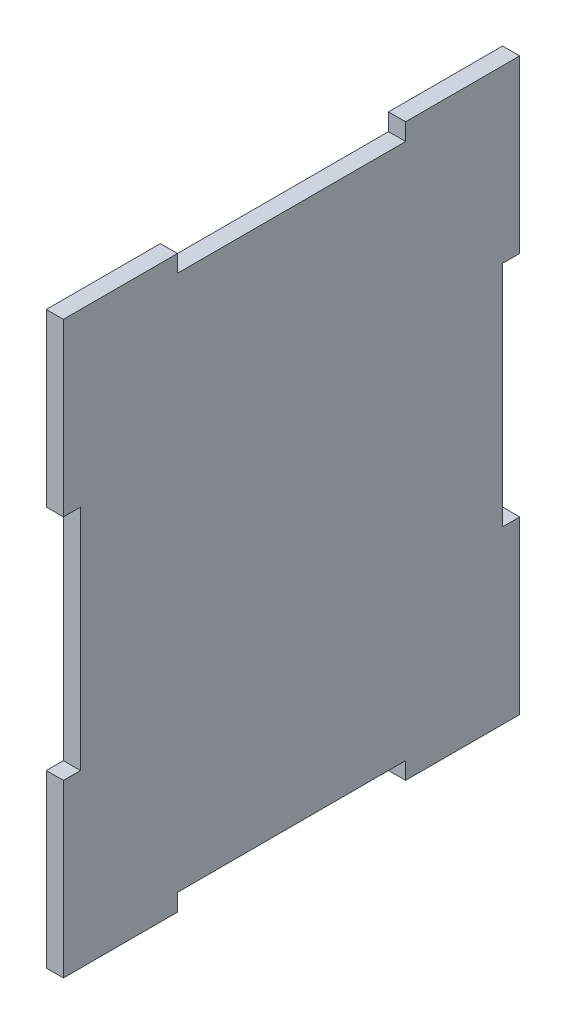
ISO-10303-21;
HEADER;
FILE_DESCRIPTION(('STEP AP214'),'2;1');
FILE_NAME('part.step','',(''),(''),'','','');
FILE_SCHEMA(('AUTOMOTIVE_DESIGN { 1 0 10303 214 1 1 1 1 }'));
ENDSEC;
DATA;
#1=APPLICATION_CONTEXT('core data for automotive mechanical design processes');
#2=APPLICATION_PROTOCOL_DEFINITION('international standard','automotive_design',2000,#1);
#3=PRODUCT_CONTEXT('',#1,'mechanical');
#4=PRODUCT('Part','Part','',(#3));
#5=PRODUCT_RELATED_PRODUCT_CATEGORY('part','',(#4));
#6=PRODUCT_DEFINITION_FORMATION('','',#4);
#7=PRODUCT_DEFINITION_CONTEXT('part definition',#1,'design');
#8=PRODUCT_DEFINITION('design','',#6,#7);
#9=PRODUCT_DEFINITION_SHAPE('','',#8);
#10=(LENGTH_UNIT() NAMED_UNIT(*) SI_UNIT(.MILLI.,.METRE.));
#11=(NAMED_UNIT(*) PLANE_ANGLE_UNIT() SI_UNIT($,.RADIAN.));
#12=(NAMED_UNIT(*) SI_UNIT($,.STERADIAN.) SOLID_ANGLE_UNIT());
#13=UNCERTAINTY_MEASURE_WITH_UNIT(LENGTH_MEASURE(1.E-05),#10,'distance_accuracy_value','');
#14=(GEOMETRIC_REPRESENTATION_CONTEXT(3) GLOBAL_UNCERTAINTY_ASSIGNED_CONTEXT((#13)) GLOBAL_UNIT_ASSIGNED_CONTEXT((#10,
#11,#12)) REPRESENTATION_CONTEXT('',''));
#15=CARTESIAN_POINT('',(0.,0.,0.));
#16=DIRECTION('',(0.,0.,1.));
#17=DIRECTION('',(1.,0.,0.));
#18=AXIS2_PLACEMENT_3D('',#15,#16,#17);
#19=CARTESIAN_POINT('',(3.,38.0748800600968,25.7354760894386));
#20=DIRECTION('',(0.,0.,-1.));
#21=DIRECTION('',(0.,1.,0.));
#22=AXIS2_PLACEMENT_3D('',#19,#20,#21);
#23=PLANE('',#22);
#24=DIRECTION('',(0.,-1.,0.));
#25=VECTOR('',#24,1.);
#26=CARTESIAN_POINT('',(0.,38.0748800600968,25.7354760894386));
#27=LINE('',#26,#25);
#28=CARTESIAN_POINT('',(0.,38.0748800600968,25.7354760894386));
#29=VERTEX_POINT('',#28);
#30=CARTESIAN_POINT('',(0.,8.07488006009679,25.7354760894386));
#31=VERTEX_POINT('',#30);
#32=EDGE_CURVE('E201',#29,#31,#27,.T.);
#33=ORIENTED_EDGE('',*,*,#32,.T.);
#34=DIRECTION('',(-1.,0.,0.));
#35=VECTOR('',#34,1.);
#36=CARTESIAN_POINT('',(3.,8.07488006009679,25.7354760894386));
#37=LINE('',#36,#35);
#38=CARTESIAN_POINT('',(3.,8.07488006009679,25.7354760894386));
#39=VERTEX_POINT('',#38);
#40=EDGE_CURVE('E11',#39,#31,#37,.T.);
#41=ORIENTED_EDGE('',*,*,#40,.F.);
#42=DIRECTION('',(0.,-1.,0.));
#43=VECTOR('',#42,1.);
#44=CARTESIAN_POINT('',(3.,38.0748800600968,25.7354760894386));
#45=LINE('',#44,#43);
#46=CARTESIAN_POINT('',(3.,38.0748800600968,25.7354760894386));
#47=VERTEX_POINT('',#46);
#48=EDGE_CURVE('E239',#47,#39,#45,.T.);
#49=ORIENTED_EDGE('',*,*,#48,.F.);
#50=DIRECTION('',(-1.,0.,0.));
#51=VECTOR('',#50,1.);
#52=CARTESIAN_POINT('',(3.,38.0748800600968,25.7354760894386));
#53=LINE('',#52,#51);
#54=EDGE_CURVE('E197',#47,#29,#53,.T.);
#55=ORIENTED_EDGE('',*,*,#54,.T.);
#56=EDGE_LOOP('',(#33,#41,#49,#55));
#57=FACE_BOUND('',#56,.T.);
#58=ADVANCED_FACE('F33',(#57),#23,.F.);
#59=CARTESIAN_POINT('',(3.,8.07488006009678,22.7354760894386));
#60=DIRECTION('',(0.,1.,0.));
#61=DIRECTION('',(0.,0.,1.));
#62=AXIS2_PLACEMENT_3D('',#59,#60,#61);
#63=PLANE('',#62);
#64=DIRECTION('',(0.,0.,-1.));
#65=VECTOR('',#64,1.);
#66=CARTESIAN_POINT('',(0.,8.07488006009678,22.7354760894386));
#67=LINE('',#66,#65);
#68=CARTESIAN_POINT('',(0.,8.07488006009678,22.7354760894386));
#69=VERTEX_POINT('',#68);
#70=EDGE_CURVE('E204',#31,#69,#67,.T.);
#71=ORIENTED_EDGE('',*,*,#70,.T.);
#72=DIRECTION('',(-1.,0.,0.));
#73=VECTOR('',#72,1.);
#74=CARTESIAN_POINT('',(3.,8.07488006009678,22.7354760894386));
#75=LINE('',#74,#73);
#76=CARTESIAN_POINT('',(3.,8.07488006009678,22.7354760894386));
#77=VERTEX_POINT('',#76);
#78=EDGE_CURVE('E41',#77,#69,#75,.T.);
#79=ORIENTED_EDGE('',*,*,#78,.F.);
#80=DIRECTION('',(0.,0.,-1.));
#81=VECTOR('',#80,1.);
#82=CARTESIAN_POINT('',(3.,8.07488006009678,22.7354760894386));
#83=LINE('',#82,#81);
#84=EDGE_CURVE('E128',#39,#77,#83,.T.);
#85=ORIENTED_EDGE('',*,*,#84,.F.);
#86=ORIENTED_EDGE('',*,*,#40,.T.);
#87=EDGE_LOOP('',(#71,#79,#85,#86));
#88=FACE_BOUND('',#87,.T.);
#89=ADVANCED_FACE('F357',(#88),#63,.F.);
#90=CARTESIAN_POINT('',(3.,8.07488006009678,22.7354760894386));
#91=DIRECTION('',(0.,0.,-1.));
#92=DIRECTION('',(0.,1.,0.));
#93=AXIS2_PLACEMENT_3D('',#90,#91,#92);
#94=PLANE('',#93);
#95=DIRECTION('',(0.,-1.,0.));
#96=VECTOR('',#95,1.);
#97=CARTESIAN_POINT('',(0.,8.07488006009678,22.7354760894386));
#98=LINE('',#97,#96);
#99=CARTESIAN_POINT('',(0.,-31.9251199399032,22.7354760894386));
#100=VERTEX_POINT('',#99);
#101=EDGE_CURVE('E206',#69,#100,#98,.T.);
#102=ORIENTED_EDGE('',*,*,#101,.T.);
#103=DIRECTION('',(-1.,0.,0.));
#104=VECTOR('',#103,1.);
#105=CARTESIAN_POINT('',(3.,-31.9251199399032,22.7354760894386));
#106=LINE('',#105,#104);
#107=CARTESIAN_POINT('',(3.,-31.9251199399032,22.7354760894386));
#108=VERTEX_POINT('',#107);
#109=EDGE_CURVE('E282',#108,#100,#106,.T.);
#110=ORIENTED_EDGE('',*,*,#109,.F.);
#111=DIRECTION('',(0.,-1.,0.));
#112=VECTOR('',#111,1.);
#113=CARTESIAN_POINT('',(3.,8.07488006009678,22.7354760894386));
#114=LINE('',#113,#112);
#115=EDGE_CURVE('E290',#77,#108,#114,.T.);
#116=ORIENTED_EDGE('',*,*,#115,.F.);
#117=ORIENTED_EDGE('',*,*,#78,.T.);
#118=EDGE_LOOP('',(#102,#110,#116,#117));
#119=FACE_BOUND('',#118,.T.);
#120=ADVANCED_FACE('F288',(#119),#94,.F.);
#121=CARTESIAN_POINT('',(3.,-31.9251199399032,25.7354760894386));
#122=DIRECTION('',(0.,-1.,0.));
#123=DIRECTION('',(0.,0.,-1.));
#124=AXIS2_PLACEMENT_3D('',#121,#122,#123);
#125=PLANE('',#124);
#126=DIRECTION('',(0.,0.,1.));
#127=VECTOR('',#126,1.);
#128=CARTESIAN_POINT('',(0.,-31.9251199399032,25.7354760894386));
#129=LINE('',#128,#127);
#130=CARTESIAN_POINT('',(0.,-31.9251199399032,25.7354760894386));
#131=VERTEX_POINT('',#130);
#132=EDGE_CURVE('E208',#100,#131,#129,.T.);
#133=ORIENTED_EDGE('',*,*,#132,.T.);
#134=DIRECTION('',(-1.,0.,0.));
#135=VECTOR('',#134,1.);
#136=CARTESIAN_POINT('',(3.,-31.9251199399032,25.7354760894386));
#137=LINE('',#136,#135);
#138=CARTESIAN_POINT('',(3.,-31.9251199399032,25.7354760894386));
#139=VERTEX_POINT('',#138);
#140=EDGE_CURVE('E279',#139,#131,#137,.T.);
#141=ORIENTED_EDGE('',*,*,#140,.F.);
#142=DIRECTION('',(0.,0.,1.));
#143=VECTOR('',#142,1.);
#144=CARTESIAN_POINT('',(3.,-31.9251199399032,25.7354760894386));
#145=LINE('',#144,#143);
#146=EDGE_CURVE('E308',#108,#139,#145,.T.);
#147=ORIENTED_EDGE('',*,*,#146,.F.);
#148=ORIENTED_EDGE('',*,*,#109,.T.);
#149=EDGE_LOOP('',(#133,#141,#147,#148));
#150=FACE_BOUND('',#149,.T.);
#151=ADVANCED_FACE('F299',(#150),#125,.F.);
#152=CARTESIAN_POINT('',(3.,-31.9251199399032,25.7354760894386));
#153=DIRECTION('',(0.,0.,-1.));
#154=DIRECTION('',(0.,1.,0.));
#155=AXIS2_PLACEMENT_3D('',#152,#153,#154);
#156=PLANE('',#155);
#157=DIRECTION('',(0.,-1.,0.));
#158=VECTOR('',#157,1.);
#159=CARTESIAN_POINT('',(0.,-31.9251199399032,25.7354760894386));
#160=LINE('',#159,#158);
#161=CARTESIAN_POINT('',(0.,-61.9251199399032,25.7354760894386));
#162=VERTEX_POINT('',#161);
#163=EDGE_CURVE('E210',#131,#162,#160,.T.);
#164=ORIENTED_EDGE('',*,*,#163,.T.);
#165=DIRECTION('',(-1.,0.,0.));
#166=VECTOR('',#165,1.);
#167=CARTESIAN_POINT('',(3.,-61.9251199399032,25.7354760894386));
#168=LINE('',#167,#166);
#169=CARTESIAN_POINT('',(3.,-61.9251199399032,25.7354760894386));
#170=VERTEX_POINT('',#169);
#171=EDGE_CURVE('E276',#170,#162,#168,.T.);
#172=ORIENTED_EDGE('',*,*,#171,.F.);
#173=DIRECTION('',(0.,-1.,0.));
#174=VECTOR('',#173,1.);
#175=CARTESIAN_POINT('',(3.,-31.9251199399032,25.7354760894386));
#176=LINE('',#175,#174);
#177=EDGE_CURVE('E305',#139,#170,#176,.T.);
#178=ORIENTED_EDGE('',*,*,#177,.F.);
#179=ORIENTED_EDGE('',*,*,#140,.T.);
#180=EDGE_LOOP('',(#164,#172,#178,#179));
#181=FACE_BOUND('',#180,.T.);
#182=ADVANCED_FACE('F303',(#181),#156,.F.);
#183=CARTESIAN_POINT('',(3.,-61.9251199399032,25.7354760894386));
#184=DIRECTION('',(0.,1.,0.));
#185=DIRECTION('',(0.,0.,1.));
#186=AXIS2_PLACEMENT_3D('',#183,#184,#185);
#187=PLANE('',#186);
#188=DIRECTION('',(0.,0.,-1.));
#189=VECTOR('',#188,1.);
#190=CARTESIAN_POINT('',(0.,-61.9251199399032,25.7354760894386));
#191=LINE('',#190,#189);
#192=CARTESIAN_POINT('',(0.,-61.9251199399032,5.73547608943856));
#193=VERTEX_POINT('',#192);
#194=EDGE_CURVE('E212',#162,#193,#191,.T.);
#195=ORIENTED_EDGE('',*,*,#194,.T.);
#196=DIRECTION('',(-1.,0.,0.));
#197=VECTOR('',#196,1.);
#198=CARTESIAN_POINT('',(3.,-61.9251199399032,5.73547608943856));
#199=LINE('',#198,#197);
#200=CARTESIAN_POINT('',(3.,-61.9251199399032,5.73547608943856));
#201=VERTEX_POINT('',#200);
#202=EDGE_CURVE('E273',#201,#193,#199,.T.);
#203=ORIENTED_EDGE('',*,*,#202,.F.);
#204=DIRECTION('',(0.,0.,-1.));
#205=VECTOR('',#204,1.);
#206=CARTESIAN_POINT('',(3.,-61.9251199399032,25.7354760894386));
#207=LINE('',#206,#205);
#208=EDGE_CURVE('E307',#170,#201,#207,.T.);
#209=ORIENTED_EDGE('',*,*,#208,.F.);
#210=ORIENTED_EDGE('',*,*,#171,.T.);
#211=EDGE_LOOP('',(#195,#203,#209,#210));
#212=FACE_BOUND('',#211,.T.);
#213=ADVANCED_FACE('F370',(#212),#187,.F.);
#214=CARTESIAN_POINT('',(3.,-61.9251199399032,5.73547608943856));
#215=DIRECTION('',(0.,0.,1.));
#216=DIRECTION('',(1.,0.,0.));
#217=AXIS2_PLACEMENT_3D('',#214,#215,#216);
#218=PLANE('',#217);
#219=DIRECTION('',(0.,1.,0.));
#220=VECTOR('',#219,1.);
#221=CARTESIAN_POINT('',(0.,-61.9251199399032,5.73547608943856));
#222=LINE('',#221,#220);
#223=CARTESIAN_POINT('',(0.,-58.9251199399032,5.73547608943856));
#224=VERTEX_POINT('',#223);
#225=EDGE_CURVE('E214',#193,#224,#222,.T.);
#226=ORIENTED_EDGE('',*,*,#225,.T.);
#227=DIRECTION('',(-1.,0.,0.));
#228=VECTOR('',#227,1.);
#229=CARTESIAN_POINT('',(3.,-58.9251199399032,5.73547608943856));
#230=LINE('',#229,#228);
#231=CARTESIAN_POINT('',(3.,-58.9251199399032,5.73547608943856));
#232=VERTEX_POINT('',#231);
#233=EDGE_CURVE('E270',#232,#224,#230,.T.);
#234=ORIENTED_EDGE('',*,*,#233,.F.);
#235=DIRECTION('',(0.,1.,0.));
#236=VECTOR('',#235,1.);
#237=CARTESIAN_POINT('',(3.,-61.9251199399032,5.73547608943856));
#238=LINE('',#237,#236);
#239=EDGE_CURVE('E310',#201,#232,#238,.T.);
#240=ORIENTED_EDGE('',*,*,#239,.F.);
#241=ORIENTED_EDGE('',*,*,#202,.T.);
#242=EDGE_LOOP('',(#226,#234,#240,#241));
#243=FACE_BOUND('',#242,.T.);
#244=ADVANCED_FACE('F373',(#243),#218,.F.);
#245=CARTESIAN_POINT('',(3.,-58.9251199399032,5.73547608943856));
#246=DIRECTION('',(0.,1.,0.));
#247=DIRECTION('',(0.,0.,1.));
#248=AXIS2_PLACEMENT_3D('',#245,#246,#247);
#249=PLANE('',#248);
#250=DIRECTION('',(0.,0.,-1.));
#251=VECTOR('',#250,1.);
#252=CARTESIAN_POINT('',(0.,-58.9251199399032,5.73547608943856));
#253=LINE('',#252,#251);
#254=CARTESIAN_POINT('',(0.,-58.9251199399032,-34.2645239105615));
#255=VERTEX_POINT('',#254);
#256=EDGE_CURVE('E216',#224,#255,#253,.T.);
#257=ORIENTED_EDGE('',*,*,#256,.T.);
#258=DIRECTION('',(-1.,0.,0.));
#259=VECTOR('',#258,1.);
#260=CARTESIAN_POINT('',(3.,-58.9251199399032,-34.2645239105615));
#261=LINE('',#260,#259);
#262=CARTESIAN_POINT('',(3.,-58.9251199399032,-34.2645239105615));
#263=VERTEX_POINT('',#262);
#264=EDGE_CURVE('E267',#263,#255,#261,.T.);
#265=ORIENTED_EDGE('',*,*,#264,.F.);
#266=DIRECTION('',(0.,0.,-1.));
#267=VECTOR('',#266,1.);
#268=CARTESIAN_POINT('',(3.,-58.9251199399032,5.73547608943856));
#269=LINE('',#268,#267);
#270=EDGE_CURVE('E316',#232,#263,#269,.T.);
#271=ORIENTED_EDGE('',*,*,#270,.F.);
#272=ORIENTED_EDGE('',*,*,#233,.T.);
#273=EDGE_LOOP('',(#257,#265,#271,#272));
#274=FACE_BOUND('',#273,.T.);
#275=ADVANCED_FACE('F377',(#274),#249,.F.);
#276=CARTESIAN_POINT('',(3.,-61.9251199399032,-34.2645239105615));
#277=DIRECTION('',(0.,0.,-1.));
#278=DIRECTION('',(0.,1.,0.));
#279=AXIS2_PLACEMENT_3D('',#276,#277,#278);
#280=PLANE('',#279);
#281=DIRECTION('',(0.,-1.,0.));
#282=VECTOR('',#281,1.);
#283=CARTESIAN_POINT('',(0.,-61.9251199399032,-34.2645239105615));
#284=LINE('',#283,#282);
#285=CARTESIAN_POINT('',(0.,-61.9251199399032,-34.2645239105615));
#286=VERTEX_POINT('',#285);
#287=EDGE_CURVE('E218',#255,#286,#284,.T.);
#288=ORIENTED_EDGE('',*,*,#287,.T.);
#289=DIRECTION('',(-1.,0.,0.));
#290=VECTOR('',#289,1.);
#291=CARTESIAN_POINT('',(3.,-61.9251199399032,-34.2645239105615));
#292=LINE('',#291,#290);
#293=CARTESIAN_POINT('',(3.,-61.9251199399032,-34.2645239105615));
#294=VERTEX_POINT('',#293);
#295=EDGE_CURVE('E264',#294,#286,#292,.T.);
#296=ORIENTED_EDGE('',*,*,#295,.F.);
#297=DIRECTION('',(0.,-1.,0.));
#298=VECTOR('',#297,1.);
#299=CARTESIAN_POINT('',(3.,-61.9251199399032,-34.2645239105615));
#300=LINE('',#299,#298);
#301=EDGE_CURVE('E318',#263,#294,#300,.T.);
#302=ORIENTED_EDGE('',*,*,#301,.F.);
#303=ORIENTED_EDGE('',*,*,#264,.T.);
#304=EDGE_LOOP('',(#288,#296,#302,#303));
#305=FACE_BOUND('',#304,.T.);
#306=ADVANCED_FACE('F381',(#305),#280,.F.);
#307=CARTESIAN_POINT('',(3.,-61.9251199399032,-34.2645239105615));
#308=DIRECTION('',(0.,1.,0.));
#309=DIRECTION('',(0.,0.,1.));
#310=AXIS2_PLACEMENT_3D('',#307,#308,#309);
#311=PLANE('',#310);
#312=DIRECTION('',(0.,0.,-1.));
#313=VECTOR('',#312,1.);
#314=CARTESIAN_POINT('',(0.,-61.9251199399032,-34.2645239105615));
#315=LINE('',#314,#313);
#316=CARTESIAN_POINT('',(0.,-61.9251199399032,-54.2645239105615));
#317=VERTEX_POINT('',#316);
#318=EDGE_CURVE('E220',#286,#317,#315,.T.);
#319=ORIENTED_EDGE('',*,*,#318,.T.);
#320=DIRECTION('',(-1.,0.,0.));
#321=VECTOR('',#320,1.);
#322=CARTESIAN_POINT('',(3.,-61.9251199399032,-54.2645239105615));
#323=LINE('',#322,#321);
#324=CARTESIAN_POINT('',(3.,-61.9251199399032,-54.2645239105615));
#325=VERTEX_POINT('',#324);
#326=EDGE_CURVE('E261',#325,#317,#323,.T.);
#327=ORIENTED_EDGE('',*,*,#326,.F.);
#328=DIRECTION('',(0.,0.,-1.));
#329=VECTOR('',#328,1.);
#330=CARTESIAN_POINT('',(3.,-61.9251199399032,-34.2645239105615));
#331=LINE('',#330,#329);
#332=EDGE_CURVE('E320',#294,#325,#331,.T.);
#333=ORIENTED_EDGE('',*,*,#332,.F.);
#334=ORIENTED_EDGE('',*,*,#295,.T.);
#335=EDGE_LOOP('',(#319,#327,#333,#334));
#336=FACE_BOUND('',#335,.T.);
#337=ADVANCED_FACE('F385',(#336),#311,.F.);
#338=CARTESIAN_POINT('',(3.,-31.9251199399032,-54.2645239105614));
#339=DIRECTION('',(0.,0.,1.));
#340=DIRECTION('',(0.,-1.,0.));
#341=AXIS2_PLACEMENT_3D('',#338,#339,#340);
#342=PLANE('',#341);
#343=DIRECTION('',(0.,1.,0.));
#344=VECTOR('',#343,1.);
#345=CARTESIAN_POINT('',(0.,-31.9251199399032,-54.2645239105614));
#346=LINE('',#345,#344);
#347=CARTESIAN_POINT('',(0.,-31.9251199399032,-54.2645239105614));
#348=VERTEX_POINT('',#347);
#349=EDGE_CURVE('E222',#317,#348,#346,.T.);
#350=ORIENTED_EDGE('',*,*,#349,.T.);
#351=DIRECTION('',(-1.,0.,0.));
#352=VECTOR('',#351,1.);
#353=CARTESIAN_POINT('',(3.,-31.9251199399032,-54.2645239105614));
#354=LINE('',#353,#352);
#355=CARTESIAN_POINT('',(3.,-31.9251199399032,-54.2645239105614));
#356=VERTEX_POINT('',#355);
#357=EDGE_CURVE('E258',#356,#348,#354,.T.);
#358=ORIENTED_EDGE('',*,*,#357,.F.);
#359=DIRECTION('',(0.,1.,0.));
#360=VECTOR('',#359,1.);
#361=CARTESIAN_POINT('',(3.,-31.9251199399032,-54.2645239105614));
#362=LINE('',#361,#360);
#363=EDGE_CURVE('E322',#325,#356,#362,.T.);
#364=ORIENTED_EDGE('',*,*,#363,.F.);
#365=ORIENTED_EDGE('',*,*,#326,.T.);
#366=EDGE_LOOP('',(#350,#358,#364,#365));
#367=FACE_BOUND('',#366,.T.);
#368=ADVANCED_FACE('F389',(#367),#342,.F.);
#369=CARTESIAN_POINT('',(3.,-31.9251199399032,-54.2645239105614));
#370=DIRECTION('',(0.,-1.,0.));
#371=DIRECTION('',(0.,0.,-1.));
#372=AXIS2_PLACEMENT_3D('',#369,#370,#371);
#373=PLANE('',#372);
#374=DIRECTION('',(0.,0.,1.));
#375=VECTOR('',#374,1.);
#376=CARTESIAN_POINT('',(0.,-31.9251199399032,-54.2645239105614));
#377=LINE('',#376,#375);
#378=CARTESIAN_POINT('',(0.,-31.9251199399032,-51.2645239105614));
#379=VERTEX_POINT('',#378);
#380=EDGE_CURVE('E224',#348,#379,#377,.T.);
#381=ORIENTED_EDGE('',*,*,#380,.T.);
#382=DIRECTION('',(-1.,0.,0.));
#383=VECTOR('',#382,1.);
#384=CARTESIAN_POINT('',(3.,-31.9251199399032,-51.2645239105614));
#385=LINE('',#384,#383);
#386=CARTESIAN_POINT('',(3.,-31.9251199399032,-51.2645239105614));
#387=VERTEX_POINT('',#386);
#388=EDGE_CURVE('E255',#387,#379,#385,.T.);
#389=ORIENTED_EDGE('',*,*,#388,.F.);
#390=DIRECTION('',(0.,0.,1.));
#391=VECTOR('',#390,1.);
#392=CARTESIAN_POINT('',(3.,-31.9251199399032,-54.2645239105614));
#393=LINE('',#392,#391);
#394=EDGE_CURVE('E324',#356,#387,#393,.T.);
#395=ORIENTED_EDGE('',*,*,#394,.F.);
#396=ORIENTED_EDGE('',*,*,#357,.T.);
#397=EDGE_LOOP('',(#381,#389,#395,#396));
#398=FACE_BOUND('',#397,.T.);
#399=ADVANCED_FACE('F393',(#398),#373,.F.);
#400=CARTESIAN_POINT('',(3.,8.07488006009679,-51.2645239105614));
#401=DIRECTION('',(0.,0.,1.));
#402=DIRECTION('',(0.,-1.,0.));
#403=AXIS2_PLACEMENT_3D('',#400,#401,#402);
#404=PLANE('',#403);
#405=DIRECTION('',(0.,1.,0.));
#406=VECTOR('',#405,1.);
#407=CARTESIAN_POINT('',(0.,8.07488006009679,-51.2645239105614));
#408=LINE('',#407,#406);
#409=CARTESIAN_POINT('',(0.,8.07488006009679,-51.2645239105614));
#410=VERTEX_POINT('',#409);
#411=EDGE_CURVE('E226',#379,#410,#408,.T.);
#412=ORIENTED_EDGE('',*,*,#411,.T.);
#413=DIRECTION('',(-1.,0.,0.));
#414=VECTOR('',#413,1.);
#415=CARTESIAN_POINT('',(3.,8.07488006009679,-51.2645239105614));
#416=LINE('',#415,#414);
#417=CARTESIAN_POINT('',(3.,8.07488006009679,-51.2645239105614));
#418=VERTEX_POINT('',#417);
#419=EDGE_CURVE('E252',#418,#410,#416,.T.);
#420=ORIENTED_EDGE('',*,*,#419,.F.);
#421=DIRECTION('',(0.,1.,0.));
#422=VECTOR('',#421,1.);
#423=CARTESIAN_POINT('',(3.,8.07488006009679,-51.2645239105614));
#424=LINE('',#423,#422);
#425=EDGE_CURVE('E326',#387,#418,#424,.T.);
#426=ORIENTED_EDGE('',*,*,#425,.F.);
#427=ORIENTED_EDGE('',*,*,#388,.T.);
#428=EDGE_LOOP('',(#412,#420,#426,#427));
#429=FACE_BOUND('',#428,.T.);
#430=ADVANCED_FACE('F397',(#429),#404,.F.);
#431=CARTESIAN_POINT('',(3.,8.07488006009679,-51.2645239105614));
#432=DIRECTION('',(0.,1.,0.));
#433=DIRECTION('',(0.,0.,1.));
#434=AXIS2_PLACEMENT_3D('',#431,#432,#433);
#435=PLANE('',#434);
#436=DIRECTION('',(0.,0.,-1.));
#437=VECTOR('',#436,1.);
#438=CARTESIAN_POINT('',(0.,8.07488006009679,-51.2645239105614));
#439=LINE('',#438,#437);
#440=CARTESIAN_POINT('',(0.,8.07488006009679,-54.2645239105614));
#441=VERTEX_POINT('',#440);
#442=EDGE_CURVE('E228',#410,#441,#439,.T.);
#443=ORIENTED_EDGE('',*,*,#442,.T.);
#444=DIRECTION('',(-1.,0.,0.));
#445=VECTOR('',#444,1.);
#446=CARTESIAN_POINT('',(3.,8.07488006009679,-54.2645239105614));
#447=LINE('',#446,#445);
#448=CARTESIAN_POINT('',(3.,8.07488006009679,-54.2645239105614));
#449=VERTEX_POINT('',#448);
#450=EDGE_CURVE('E249',#449,#441,#447,.T.);
#451=ORIENTED_EDGE('',*,*,#450,.F.);
#452=DIRECTION('',(0.,0.,-1.));
#453=VECTOR('',#452,1.);
#454=CARTESIAN_POINT('',(3.,8.07488006009679,-51.2645239105614));
#455=LINE('',#454,#453);
#456=EDGE_CURVE('E328',#418,#449,#455,.T.);
#457=ORIENTED_EDGE('',*,*,#456,.F.);
#458=ORIENTED_EDGE('',*,*,#419,.T.);
#459=EDGE_LOOP('',(#443,#451,#457,#458));
#460=FACE_BOUND('',#459,.T.);
#461=ADVANCED_FACE('F401',(#460),#435,.F.);
#462=CARTESIAN_POINT('',(3.,38.0748800600968,-54.2645239105614));
#463=DIRECTION('',(0.,0.,1.));
#464=DIRECTION('',(0.,-1.,0.));
#465=AXIS2_PLACEMENT_3D('',#462,#463,#464);
#466=PLANE('',#465);
#467=DIRECTION('',(0.,1.,0.));
#468=VECTOR('',#467,1.);
#469=CARTESIAN_POINT('',(0.,38.0748800600968,-54.2645239105614));
#470=LINE('',#469,#468);
#471=CARTESIAN_POINT('',(0.,38.0748800600968,-54.2645239105614));
#472=VERTEX_POINT('',#471);
#473=EDGE_CURVE('E230',#441,#472,#470,.T.);
#474=ORIENTED_EDGE('',*,*,#473,.T.);
#475=DIRECTION('',(-1.,0.,0.));
#476=VECTOR('',#475,1.);
#477=CARTESIAN_POINT('',(3.,38.0748800600968,-54.2645239105614));
#478=LINE('',#477,#476);
#479=CARTESIAN_POINT('',(3.,38.0748800600968,-54.2645239105614));
#480=VERTEX_POINT('',#479);
#481=EDGE_CURVE('E246',#480,#472,#478,.T.);
#482=ORIENTED_EDGE('',*,*,#481,.F.);
#483=DIRECTION('',(0.,1.,0.));
#484=VECTOR('',#483,1.);
#485=CARTESIAN_POINT('',(3.,38.0748800600968,-54.2645239105614));
#486=LINE('',#485,#484);
#487=EDGE_CURVE('E330',#449,#480,#486,.T.);
#488=ORIENTED_EDGE('',*,*,#487,.F.);
#489=ORIENTED_EDGE('',*,*,#450,.T.);
#490=EDGE_LOOP('',(#474,#482,#488,#489));
#491=FACE_BOUND('',#490,.T.);
#492=ADVANCED_FACE('F405',(#491),#466,.F.);
#493=CARTESIAN_POINT('',(3.,38.0748800600968,-34.2645239105614));
#494=DIRECTION('',(0.,-1.,0.));
#495=DIRECTION('',(0.,0.,-1.));
#496=AXIS2_PLACEMENT_3D('',#493,#494,#495);
#497=PLANE('',#496);
#498=DIRECTION('',(0.,0.,1.));
#499=VECTOR('',#498,1.);
#500=CARTESIAN_POINT('',(0.,38.0748800600968,-34.2645239105614));
#501=LINE('',#500,#499);
#502=CARTESIAN_POINT('',(0.,38.0748800600968,-34.2645239105614));
#503=VERTEX_POINT('',#502);
#504=EDGE_CURVE('E232',#472,#503,#501,.T.);
#505=ORIENTED_EDGE('',*,*,#504,.T.);
#506=DIRECTION('',(-1.,0.,0.));
#507=VECTOR('',#506,1.);
#508=CARTESIAN_POINT('',(3.,38.0748800600968,-34.2645239105614));
#509=LINE('',#508,#507);
#510=CARTESIAN_POINT('',(3.,38.0748800600968,-34.2645239105614));
#511=VERTEX_POINT('',#510);
#512=EDGE_CURVE('E243',#511,#503,#509,.T.);
#513=ORIENTED_EDGE('',*,*,#512,.F.);
#514=DIRECTION('',(0.,0.,1.));
#515=VECTOR('',#514,1.);
#516=CARTESIAN_POINT('',(3.,38.0748800600968,-34.2645239105614));
#517=LINE('',#516,#515);
#518=EDGE_CURVE('E332',#480,#511,#517,.T.);
#519=ORIENTED_EDGE('',*,*,#518,.F.);
#520=ORIENTED_EDGE('',*,*,#481,.T.);
#521=EDGE_LOOP('',(#505,#513,#519,#520));
#522=FACE_BOUND('',#521,.T.);
#523=ADVANCED_FACE('F338',(#522),#497,.F.);
#524=CARTESIAN_POINT('',(3.,38.0748800600968,-34.2645239105614));
#525=DIRECTION('',(0.,0.,-1.));
#526=DIRECTION('',(-1.,0.,0.));
#527=AXIS2_PLACEMENT_3D('',#524,#525,#526);
#528=PLANE('',#527);
#529=DIRECTION('',(0.,-1.,0.));
#530=VECTOR('',#529,1.);
#531=CARTESIAN_POINT('',(0.,38.0748800600968,-34.2645239105614));
#532=LINE('',#531,#530);
#533=CARTESIAN_POINT('',(0.,35.0748800600968,-34.2645239105614));
#534=VERTEX_POINT('',#533);
#535=EDGE_CURVE('E234',#503,#534,#532,.T.);
#536=ORIENTED_EDGE('',*,*,#535,.T.);
#537=DIRECTION('',(-1.,0.,0.));
#538=VECTOR('',#537,1.);
#539=CARTESIAN_POINT('',(3.,35.0748800600968,-34.2645239105614));
#540=LINE('',#539,#538);
#541=CARTESIAN_POINT('',(3.,35.0748800600968,-34.2645239105614));
#542=VERTEX_POINT('',#541);
#543=EDGE_CURVE('E192',#542,#534,#540,.T.);
#544=ORIENTED_EDGE('',*,*,#543,.F.);
#545=DIRECTION('',(0.,-1.,0.));
#546=VECTOR('',#545,1.);
#547=CARTESIAN_POINT('',(3.,38.0748800600968,-34.2645239105614));
#548=LINE('',#547,#546);
#549=EDGE_CURVE('E183',#511,#542,#548,.T.);
#550=ORIENTED_EDGE('',*,*,#549,.F.);
#551=ORIENTED_EDGE('',*,*,#512,.T.);
#552=EDGE_LOOP('',(#536,#544,#550,#551));
#553=FACE_BOUND('',#552,.T.);
#554=ADVANCED_FACE('F342',(#553),#528,.F.);
#555=CARTESIAN_POINT('',(3.,35.0748800600968,5.73547608943856));
#556=DIRECTION('',(0.,-1.,0.));
#557=DIRECTION('',(0.,0.,-1.));
#558=AXIS2_PLACEMENT_3D('',#555,#556,#557);
#559=PLANE('',#558);
#560=DIRECTION('',(0.,0.,1.));
#561=VECTOR('',#560,1.);
#562=CARTESIAN_POINT('',(0.,35.0748800600968,5.73547608943856));
#563=LINE('',#562,#561);
#564=CARTESIAN_POINT('',(0.,35.0748800600968,5.73547608943856));
#565=VERTEX_POINT('',#564);
#566=EDGE_CURVE('E191',#534,#565,#563,.T.);
#567=ORIENTED_EDGE('',*,*,#566,.T.);
#568=DIRECTION('',(-1.,0.,0.));
#569=VECTOR('',#568,1.);
#570=CARTESIAN_POINT('',(3.,35.0748800600968,5.73547608943856));
#571=LINE('',#570,#569);
#572=CARTESIAN_POINT('',(3.,35.0748800600968,5.73547608943856));
#573=VERTEX_POINT('',#572);
#574=EDGE_CURVE('E188',#573,#565,#571,.T.);
#575=ORIENTED_EDGE('',*,*,#574,.F.);
#576=DIRECTION('',(0.,0.,1.));
#577=VECTOR('',#576,1.);
#578=CARTESIAN_POINT('',(3.,35.0748800600968,5.73547608943856));
#579=LINE('',#578,#577);
#580=EDGE_CURVE('E177',#542,#573,#579,.T.);
#581=ORIENTED_EDGE('',*,*,#580,.F.);
#582=ORIENTED_EDGE('',*,*,#543,.T.);
#583=EDGE_LOOP('',(#567,#575,#581,#582));
#584=FACE_BOUND('',#583,.T.);
#585=ADVANCED_FACE('F189',(#584),#559,.F.);
#586=CARTESIAN_POINT('',(3.,38.0748800600968,5.73547608943857));
#587=DIRECTION('',(0.,0.,1.));
#588=DIRECTION('',(0.,-1.,0.));
#589=AXIS2_PLACEMENT_3D('',#586,#587,#588);
#590=PLANE('',#589);
#591=DIRECTION('',(0.,1.,0.));
#592=VECTOR('',#591,1.);
#593=CARTESIAN_POINT('',(0.,38.0748800600968,5.73547608943857));
#594=LINE('',#593,#592);
#595=CARTESIAN_POINT('',(0.,38.0748800600968,5.73547608943857));
#596=VERTEX_POINT('',#595);
#597=EDGE_CURVE('E114',#565,#596,#594,.T.);
#598=ORIENTED_EDGE('',*,*,#597,.T.);
#599=DIRECTION('',(-1.,0.,0.));
#600=VECTOR('',#599,1.);
#601=CARTESIAN_POINT('',(3.,38.0748800600968,5.73547608943857));
#602=LINE('',#601,#600);
#603=CARTESIAN_POINT('',(3.,38.0748800600968,5.73547608943857));
#604=VERTEX_POINT('',#603);
#605=EDGE_CURVE('E193',#604,#596,#602,.T.);
#606=ORIENTED_EDGE('',*,*,#605,.F.);
#607=DIRECTION('',(0.,1.,0.));
#608=VECTOR('',#607,1.);
#609=CARTESIAN_POINT('',(3.,38.0748800600968,5.73547608943857));
#610=LINE('',#609,#608);
#611=EDGE_CURVE('E181',#573,#604,#610,.T.);
#612=ORIENTED_EDGE('',*,*,#611,.F.);
#613=ORIENTED_EDGE('',*,*,#574,.T.);
#614=EDGE_LOOP('',(#598,#606,#612,#613));
#615=FACE_BOUND('',#614,.T.);
#616=ADVANCED_FACE('F195',(#615),#590,.F.);
#617=CARTESIAN_POINT('',(3.,38.0748800600968,25.7354760894386));
#618=DIRECTION('',(0.,-1.,0.));
#619=DIRECTION('',(0.,0.,-1.));
#620=AXIS2_PLACEMENT_3D('',#617,#618,#619);
#621=PLANE('',#620);
#622=DIRECTION('',(0.,0.,1.));
#623=VECTOR('',#622,1.);
#624=CARTESIAN_POINT('',(0.,38.0748800600968,25.7354760894386));
#625=LINE('',#624,#623);
#626=EDGE_CURVE('E120',#596,#29,#625,.T.);
#627=ORIENTED_EDGE('',*,*,#626,.T.);
#628=ORIENTED_EDGE('',*,*,#54,.F.);
#629=DIRECTION('',(0.,0.,1.));
#630=VECTOR('',#629,1.);
#631=CARTESIAN_POINT('',(3.,38.0748800600968,25.7354760894386));
#632=LINE('',#631,#630);
#633=EDGE_CURVE('E49',#604,#47,#632,.T.);
#634=ORIENTED_EDGE('',*,*,#633,.F.);
#635=ORIENTED_EDGE('',*,*,#605,.T.);
#636=EDGE_LOOP('',(#627,#628,#634,#635));
#637=FACE_BOUND('',#636,.T.);
#638=ADVANCED_FACE('F346',(#637),#621,.F.);
#639=CARTESIAN_POINT('',(3.,0.,0.));
#640=DIRECTION('',(-1.,0.,0.));
#641=DIRECTION('',(0.,0.,1.));
#642=AXIS2_PLACEMENT_3D('',#639,#640,#641);
#643=PLANE('',#642);
#644=ORIENTED_EDGE('',*,*,#48,.T.);
#645=ORIENTED_EDGE('',*,*,#84,.T.);
#646=ORIENTED_EDGE('',*,*,#115,.T.);
#647=ORIENTED_EDGE('',*,*,#146,.T.);
#648=ORIENTED_EDGE('',*,*,#177,.T.);
#649=ORIENTED_EDGE('',*,*,#208,.T.);
#650=ORIENTED_EDGE('',*,*,#239,.T.);
#651=ORIENTED_EDGE('',*,*,#270,.T.);
#652=ORIENTED_EDGE('',*,*,#301,.T.);
#653=ORIENTED_EDGE('',*,*,#332,.T.);
#654=ORIENTED_EDGE('',*,*,#363,.T.);
#655=ORIENTED_EDGE('',*,*,#394,.T.);
#656=ORIENTED_EDGE('',*,*,#425,.T.);
#657=ORIENTED_EDGE('',*,*,#456,.T.);
#658=ORIENTED_EDGE('',*,*,#487,.T.);
#659=ORIENTED_EDGE('',*,*,#518,.T.);
#660=ORIENTED_EDGE('',*,*,#549,.T.);
#661=ORIENTED_EDGE('',*,*,#580,.T.);
#662=ORIENTED_EDGE('',*,*,#611,.T.);
#663=ORIENTED_EDGE('',*,*,#633,.T.);
#664=EDGE_LOOP('',(#644,#645,#646,#647,#648,#649,#650,#651,#652,#653,#654,#655,#656,#657,#658,
#659,#660,#661,#662,#663));
#665=FACE_BOUND('',#664,.T.);
#666=ADVANCED_FACE('F179',(#665),#643,.F.);
#667=CARTESIAN_POINT('',(0.,0.,0.));
#668=DIRECTION('',(-1.,0.,0.));
#669=DIRECTION('',(0.,0.,1.));
#670=AXIS2_PLACEMENT_3D('',#667,#668,#669);
#671=PLANE('',#670);
#672=ORIENTED_EDGE('',*,*,#32,.F.);
#673=ORIENTED_EDGE('',*,*,#626,.F.);
#674=ORIENTED_EDGE('',*,*,#597,.F.);
#675=ORIENTED_EDGE('',*,*,#566,.F.);
#676=ORIENTED_EDGE('',*,*,#535,.F.);
#677=ORIENTED_EDGE('',*,*,#504,.F.);
#678=ORIENTED_EDGE('',*,*,#473,.F.);
#679=ORIENTED_EDGE('',*,*,#442,.F.);
#680=ORIENTED_EDGE('',*,*,#411,.F.);
#681=ORIENTED_EDGE('',*,*,#380,.F.);
#682=ORIENTED_EDGE('',*,*,#349,.F.);
#683=ORIENTED_EDGE('',*,*,#318,.F.);
#684=ORIENTED_EDGE('',*,*,#287,.F.);
#685=ORIENTED_EDGE('',*,*,#256,.F.);
#686=ORIENTED_EDGE('',*,*,#225,.F.);
#687=ORIENTED_EDGE('',*,*,#194,.F.);
#688=ORIENTED_EDGE('',*,*,#163,.F.);
#689=ORIENTED_EDGE('',*,*,#132,.F.);
#690=ORIENTED_EDGE('',*,*,#101,.F.);
#691=ORIENTED_EDGE('',*,*,#70,.F.);
#692=EDGE_LOOP('',(#672,#673,#674,#675,#676,#677,#678,#679,#680,#681,#682,#683,#684,#685,#686,
#687,#688,#689,#690,#691));
#693=FACE_BOUND('',#692,.T.);
#694=ADVANCED_FACE('F294',(#693),#671,.T.);
#695=CLOSED_SHELL('',(#58,#89,#120,#151,#182,#213,#244,#275,#306,#337,#368,#399,#430,#461,#492,
#523,#554,#585,#616,#638,#666,#694));
#696=MANIFOLD_SOLID_BREP('B2',#695);
#697=ADVANCED_BREP_SHAPE_REPRESENTATION('',(#18,#696),#14);
#698=SHAPE_DEFINITION_REPRESENTATION(#9,#697);
ENDSEC;
END-ISO-10303-21;
